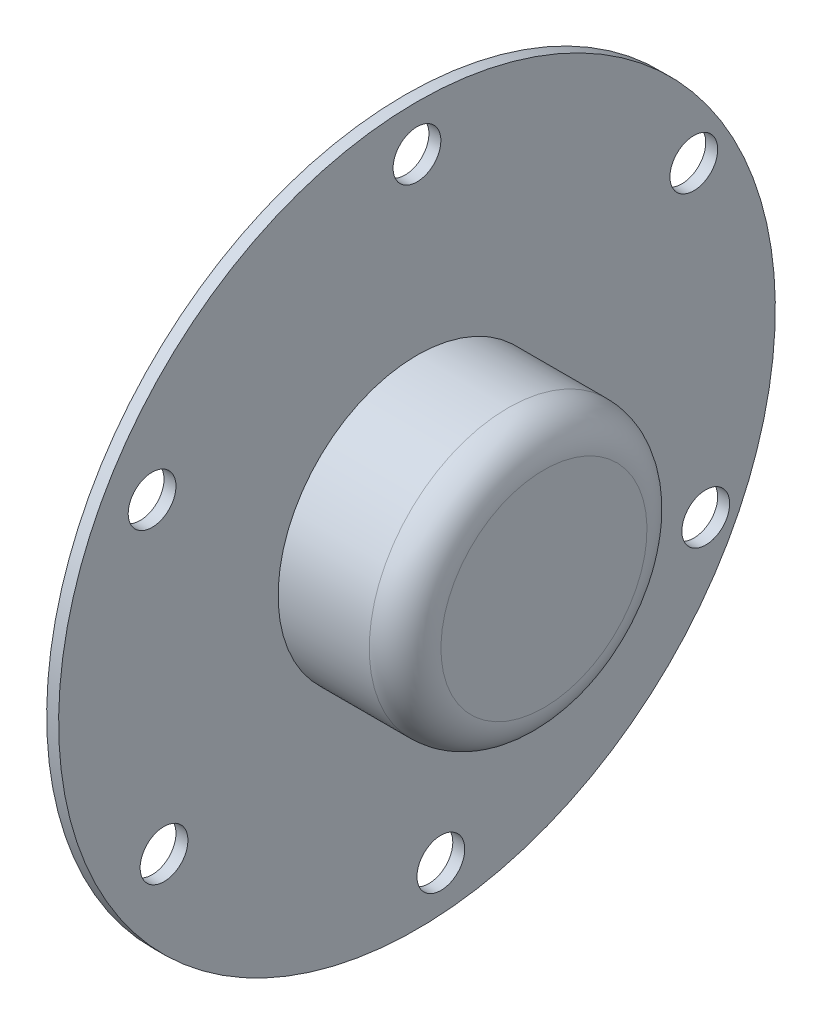
ISO-10303-21;
HEADER;
FILE_DESCRIPTION(('STEP AP214'),'2;1');
FILE_NAME('part.step','',(''),(''),'','','');
FILE_SCHEMA(('AUTOMOTIVE_DESIGN { 1 0 10303 214 1 1 1 1 }'));
ENDSEC;
DATA;
#1=APPLICATION_CONTEXT('core data for automotive mechanical design processes');
#2=APPLICATION_PROTOCOL_DEFINITION('international standard','automotive_design',2000,#1);
#3=PRODUCT_CONTEXT('',#1,'mechanical');
#4=PRODUCT('Part','Part','',(#3));
#5=PRODUCT_RELATED_PRODUCT_CATEGORY('part','',(#4));
#6=PRODUCT_DEFINITION_FORMATION('','',#4);
#7=PRODUCT_DEFINITION_CONTEXT('part definition',#1,'design');
#8=PRODUCT_DEFINITION('design','',#6,#7);
#9=PRODUCT_DEFINITION_SHAPE('','',#8);
#10=(LENGTH_UNIT() NAMED_UNIT(*) SI_UNIT(.MILLI.,.METRE.));
#11=(NAMED_UNIT(*) PLANE_ANGLE_UNIT() SI_UNIT($,.RADIAN.));
#12=(NAMED_UNIT(*) SI_UNIT($,.STERADIAN.) SOLID_ANGLE_UNIT());
#13=UNCERTAINTY_MEASURE_WITH_UNIT(LENGTH_MEASURE(1.E-05),#10,'distance_accuracy_value','');
#14=(GEOMETRIC_REPRESENTATION_CONTEXT(3) GLOBAL_UNCERTAINTY_ASSIGNED_CONTEXT((#13)) GLOBAL_UNIT_ASSIGNED_CONTEXT((#10,
#11,#12)) REPRESENTATION_CONTEXT('',''));
#15=CARTESIAN_POINT('',(0.,0.,0.));
#16=DIRECTION('',(0.,0.,1.));
#17=DIRECTION('',(1.,0.,0.));
#18=AXIS2_PLACEMENT_3D('',#15,#16,#17);
#19=CARTESIAN_POINT('',(1.00000000000016,0.,0.));
#20=DIRECTION('',(-1.,0.,0.));
#21=DIRECTION('',(0.,-1.,0.));
#22=AXIS2_PLACEMENT_3D('',#19,#20,#21);
#23=PLANE('',#22);
#24=CARTESIAN_POINT('',(0.999999999999973,36.80872946,0.));
#25=DIRECTION('',(1.,0.,0.));
#26=DIRECTION('',(0.,1.,0.));
#27=AXIS2_PLACEMENT_3D('',#24,#25,#26);
#28=CIRCLE('',#27,2.);
#29=CARTESIAN_POINT('',(0.999999999999962,38.80872946,0.));
#30=VERTEX_POINT('',#29);
#31=EDGE_CURVE('E58',#30,#30,#28,.T.);
#32=ORIENTED_EDGE('',*,*,#31,.F.);
#33=EDGE_LOOP('',(#32));
#34=FACE_BOUND('',#33,.T.);
#35=CARTESIAN_POINT('',(1.00000000000004,22.8508393262151,22.1757748781788));
#36=DIRECTION('',(1.,0.,0.));
#37=DIRECTION('',(0.,1.,0.));
#38=AXIS2_PLACEMENT_3D('',#35,#36,#37);
#39=CIRCLE('',#38,2.);
#40=CARTESIAN_POINT('',(1.00000000000003,24.8508393262151,22.1757748781788));
#41=VERTEX_POINT('',#40);
#42=EDGE_CURVE('E127',#41,#41,#39,.T.);
#43=ORIENTED_EDGE('',*,*,#42,.F.);
#44=EDGE_LOOP('',(#43));
#45=FACE_BOUND('',#44,.T.);
#46=CARTESIAN_POINT('',(1.00000000000018,-3.33289013378488,21.1757748781784));
#47=DIRECTION('',(1.,0.,0.));
#48=DIRECTION('',(0.,1.,0.));
#49=AXIS2_PLACEMENT_3D('',#46,#47,#48);
#50=CIRCLE('',#49,2.);
#51=CARTESIAN_POINT('',(1.00000000000017,-1.33289013378488,21.1757748781784));
#52=VERTEX_POINT('',#51);
#53=EDGE_CURVE('E83',#52,#52,#50,.T.);
#54=ORIENTED_EDGE('',*,*,#53,.F.);
#55=EDGE_LOOP('',(#54));
#56=FACE_BOUND('',#55,.T.);
#57=CARTESIAN_POINT('',(1.00000000000024,-15.5587294600001,-2.00000000000089));
#58=DIRECTION('',(1.,0.,0.));
#59=DIRECTION('',(0.,1.,0.));
#60=AXIS2_PLACEMENT_3D('',#57,#58,#59);
#61=CIRCLE('',#60,2.);
#62=CARTESIAN_POINT('',(1.00000000000023,-13.5587294600001,-2.00000000000089));
#63=VERTEX_POINT('',#62);
#64=EDGE_CURVE('E134',#63,#63,#61,.T.);
#65=ORIENTED_EDGE('',*,*,#64,.F.);
#66=EDGE_LOOP('',(#65));
#67=FACE_BOUND('',#66,.T.);
#68=CARTESIAN_POINT('',(1.00000000000017,-1.60083932621522,-24.1757748781797));
#69=DIRECTION('',(1.,0.,0.));
#70=DIRECTION('',(0.,1.,0.));
#71=AXIS2_PLACEMENT_3D('',#68,#69,#70);
#72=CIRCLE('',#71,2.);
#73=CARTESIAN_POINT('',(1.00000000000016,0.399160673784787,-24.1757748781797));
#74=VERTEX_POINT('',#73);
#75=EDGE_CURVE('E138',#74,#74,#72,.T.);
#76=ORIENTED_EDGE('',*,*,#75,.F.);
#77=EDGE_LOOP('',(#76));
#78=FACE_BOUND('',#77,.T.);
#79=CARTESIAN_POINT('',(1.00000000000004,24.5828901337848,-23.1757748781792));
#80=DIRECTION('',(1.,0.,0.));
#81=DIRECTION('',(0.,1.,0.));
#82=AXIS2_PLACEMENT_3D('',#79,#80,#81);
#83=CIRCLE('',#82,2.);
#84=CARTESIAN_POINT('',(1.00000000000003,26.5828901337848,-23.1757748781792));
#85=VERTEX_POINT('',#84);
#86=EDGE_CURVE('E142',#85,#85,#83,.T.);
#87=ORIENTED_EDGE('',*,*,#86,.F.);
#88=EDGE_LOOP('',(#87));
#89=FACE_BOUND('',#88,.T.);
#90=CARTESIAN_POINT('',(1.00000000000006,10.625,0.));
#91=DIRECTION('',(1.,0.,0.));
#92=DIRECTION('',(0.,1.,0.));
#93=AXIS2_PLACEMENT_3D('',#90,#91,#92);
#94=CIRCLE('',#93,11.6250000000001);
#95=CARTESIAN_POINT('',(1.,22.25,0.));
#96=VERTEX_POINT('',#95);
#97=EDGE_CURVE('E71',#96,#96,#94,.T.);
#98=ORIENTED_EDGE('',*,*,#97,.F.);
#99=EDGE_LOOP('',(#98));
#100=FACE_BOUND('',#99,.T.);
#101=CARTESIAN_POINT('',(1.00000000000016,10.625,0.));
#102=DIRECTION('',(1.,0.,0.));
#103=DIRECTION('',(0.,1.,0.));
#104=AXIS2_PLACEMENT_3D('',#101,#102,#103);
#105=CIRCLE('',#104,30.);
#106=CARTESIAN_POINT('',(1.,40.625,0.));
#107=VERTEX_POINT('',#106);
#108=EDGE_CURVE('E50',#107,#107,#105,.T.);
#109=ORIENTED_EDGE('',*,*,#108,.T.);
#110=EDGE_LOOP('',(#109));
#111=FACE_BOUND('',#110,.T.);
#112=ADVANCED_FACE('F37',(#34,#45,#56,#67,#78,#89,#100,#111),#23,.F.);
#113=CARTESIAN_POINT('',(11.63,10.625,0.));
#114=DIRECTION('',(1.,0.,0.));
#115=DIRECTION('',(0.,1.,0.));
#116=AXIS2_PLACEMENT_3D('',#113,#114,#115);
#117=CYLINDRICAL_SURFACE('',#116,30.0000000000001);
#118=ORIENTED_EDGE('',*,*,#108,.F.);
#119=EDGE_LOOP('',(#118));
#120=FACE_BOUND('',#119,.T.);
#121=CARTESIAN_POINT('',(1.56125112837913E-13,10.6249999999999,0.));
#122=DIRECTION('',(1.,0.,0.));
#123=DIRECTION('',(0.,1.,0.));
#124=AXIS2_PLACEMENT_3D('',#121,#122,#123);
#125=CIRCLE('',#124,30.0000000000001);
#126=CARTESIAN_POINT('',(0.,40.625,0.));
#127=VERTEX_POINT('',#126);
#128=EDGE_CURVE('E88',#127,#127,#125,.T.);
#129=ORIENTED_EDGE('',*,*,#128,.T.);
#130=EDGE_LOOP('',(#129));
#131=FACE_BOUND('',#130,.T.);
#132=ADVANCED_FACE('F94',(#120,#131),#117,.T.);
#133=CARTESIAN_POINT('',(1.60203007576216E-13,0.,0.));
#134=DIRECTION('',(1.,0.,0.));
#135=DIRECTION('',(0.,1.,0.));
#136=AXIS2_PLACEMENT_3D('',#133,#134,#135);
#137=PLANE('',#136);
#138=CARTESIAN_POINT('',(0.,36.80872946,0.));
#139=DIRECTION('',(1.,0.,0.));
#140=DIRECTION('',(0.,1.,0.));
#141=AXIS2_PLACEMENT_3D('',#138,#139,#140);
#142=CIRCLE('',#141,2.);
#143=CARTESIAN_POINT('',(0.,38.80872946,0.));
#144=VERTEX_POINT('',#143);
#145=EDGE_CURVE('E41',#144,#144,#142,.T.);
#146=ORIENTED_EDGE('',*,*,#145,.T.);
#147=EDGE_LOOP('',(#146));
#148=FACE_BOUND('',#147,.T.);
#149=CARTESIAN_POINT('',(0.,22.8508393262151,22.1757748781788));
#150=DIRECTION('',(1.,0.,0.));
#151=DIRECTION('',(0.,1.,0.));
#152=AXIS2_PLACEMENT_3D('',#149,#150,#151);
#153=CIRCLE('',#152,2.);
#154=CARTESIAN_POINT('',(0.,24.8508393262151,22.1757748781788));
#155=VERTEX_POINT('',#154);
#156=EDGE_CURVE('E66',#155,#155,#153,.T.);
#157=ORIENTED_EDGE('',*,*,#156,.T.);
#158=EDGE_LOOP('',(#157));
#159=FACE_BOUND('',#158,.T.);
#160=CARTESIAN_POINT('',(1.77592315853126E-13,-3.33289013378488,21.1757748781784));
#161=DIRECTION('',(1.,0.,0.));
#162=DIRECTION('',(0.,1.,0.));
#163=AXIS2_PLACEMENT_3D('',#160,#161,#162);
#164=CIRCLE('',#163,2.);
#165=CARTESIAN_POINT('',(1.67235757787592E-13,-1.33289013378488,21.1757748781784));
#166=VERTEX_POINT('',#165);
#167=EDGE_CURVE('E64',#166,#166,#164,.T.);
#168=ORIENTED_EDGE('',*,*,#167,.T.);
#169=EDGE_LOOP('',(#168));
#170=FACE_BOUND('',#169,.T.);
#171=CARTESIAN_POINT('',(2.40909722726279E-13,-15.5587294600001,-2.00000000000089));
#172=DIRECTION('',(1.,0.,0.));
#173=DIRECTION('',(0.,1.,0.));
#174=AXIS2_PLACEMENT_3D('',#171,#172,#173);
#175=CIRCLE('',#174,2.);
#176=CARTESIAN_POINT('',(2.30553164660746E-13,-13.5587294600001,-2.00000000000089));
#177=VERTEX_POINT('',#176);
#178=EDGE_CURVE('E61',#177,#177,#175,.T.);
#179=ORIENTED_EDGE('',*,*,#178,.T.);
#180=EDGE_LOOP('',(#179));
#181=FACE_BOUND('',#180,.T.);
#182=CARTESIAN_POINT('',(1.68485017604247E-13,-1.60083932621522,-24.1757748781797));
#183=DIRECTION('',(1.,0.,0.));
#184=DIRECTION('',(0.,1.,0.));
#185=AXIS2_PLACEMENT_3D('',#182,#183,#184);
#186=CIRCLE('',#185,2.);
#187=CARTESIAN_POINT('',(1.58128459538714E-13,0.399160673784782,-24.1757748781797));
#188=VERTEX_POINT('',#187);
#189=EDGE_CURVE('E57',#188,#188,#186,.T.);
#190=ORIENTED_EDGE('',*,*,#189,.T.);
#191=EDGE_LOOP('',(#190));
#192=FACE_BOUND('',#191,.T.);
#193=CARTESIAN_POINT('',(0.,24.5828901337848,-23.1757748781792));
#194=DIRECTION('',(1.,0.,0.));
#195=DIRECTION('',(0.,1.,0.));
#196=AXIS2_PLACEMENT_3D('',#193,#194,#195);
#197=CIRCLE('',#196,2.);
#198=CARTESIAN_POINT('',(0.,26.5828901337848,-23.1757748781792));
#199=VERTEX_POINT('',#198);
#200=EDGE_CURVE('E54',#199,#199,#197,.T.);
#201=ORIENTED_EDGE('',*,*,#200,.T.);
#202=EDGE_LOOP('',(#201));
#203=FACE_BOUND('',#202,.T.);
#204=ORIENTED_EDGE('',*,*,#128,.F.);
#205=EDGE_LOOP('',(#204));
#206=FACE_BOUND('',#205,.T.);
#207=CARTESIAN_POINT('',(0.,10.6249999999999,0.));
#208=DIRECTION('',(1.,0.,0.));
#209=DIRECTION('',(0.,1.,0.));
#210=AXIS2_PLACEMENT_3D('',#207,#208,#209);
#211=CIRCLE('',#210,10.6250000000001);
#212=CARTESIAN_POINT('',(0.,21.25,0.));
#213=VERTEX_POINT('',#212);
#214=EDGE_CURVE('E80',#213,#213,#211,.T.);
#215=ORIENTED_EDGE('',*,*,#214,.T.);
#216=EDGE_LOOP('',(#215));
#217=FACE_BOUND('',#216,.T.);
#218=ADVANCED_FACE('F97',(#148,#159,#170,#181,#192,#203,#206,#217),#137,.F.);
#219=CARTESIAN_POINT('',(11.63,10.625,0.));
#220=DIRECTION('',(1.,0.,0.));
#221=DIRECTION('',(0.,1.,0.));
#222=AXIS2_PLACEMENT_3D('',#219,#220,#221);
#223=CYLINDRICAL_SURFACE('',#222,10.625);
#224=CARTESIAN_POINT('',(10.6250000000001,10.625,0.));
#225=DIRECTION('',(1.,0.,0.));
#226=DIRECTION('',(0.,1.,0.));
#227=AXIS2_PLACEMENT_3D('',#224,#225,#226);
#228=CIRCLE('',#227,10.625);
#229=CARTESIAN_POINT('',(10.625,21.25,0.));
#230=VERTEX_POINT('',#229);
#231=EDGE_CURVE('E75',#230,#230,#228,.T.);
#232=ORIENTED_EDGE('',*,*,#231,.T.);
#233=EDGE_LOOP('',(#232));
#234=FACE_BOUND('',#233,.T.);
#235=ORIENTED_EDGE('',*,*,#214,.F.);
#236=EDGE_LOOP('',(#235));
#237=FACE_BOUND('',#236,.T.);
#238=ADVANCED_FACE('F103',(#234,#237),#223,.F.);
#239=CARTESIAN_POINT('',(10.6250000000001,0.,0.));
#240=DIRECTION('',(-1.,0.,0.));
#241=DIRECTION('',(0.,-1.,0.));
#242=AXIS2_PLACEMENT_3D('',#239,#240,#241);
#243=PLANE('',#242);
#244=ORIENTED_EDGE('',*,*,#231,.F.);
#245=EDGE_LOOP('',(#244));
#246=FACE_BOUND('',#245,.T.);
#247=ADVANCED_FACE('F108',(#246),#243,.T.);
#248=CARTESIAN_POINT('',(11.6300000000001,0.,0.));
#249=DIRECTION('',(-1.,0.,0.));
#250=DIRECTION('',(0.,-1.,0.));
#251=AXIS2_PLACEMENT_3D('',#248,#249,#250);
#252=PLANE('',#251);
#253=CARTESIAN_POINT('',(11.63,10.625,0.));
#254=DIRECTION('',(-1.,0.,0.));
#255=DIRECTION('',(0.,-1.,0.));
#256=AXIS2_PLACEMENT_3D('',#253,#254,#255);
#257=CIRCLE('',#256,8.62500000000002);
#258=CARTESIAN_POINT('',(11.6300000000001,1.99999999999998,0.));
#259=VERTEX_POINT('',#258);
#260=EDGE_CURVE('E45',#259,#259,#257,.F.);
#261=ORIENTED_EDGE('',*,*,#260,.T.);
#262=EDGE_LOOP('',(#261));
#263=FACE_BOUND('',#262,.T.);
#264=ADVANCED_FACE('F114',(#263),#252,.F.);
#265=CARTESIAN_POINT('',(11.63,10.625,0.));
#266=DIRECTION('',(1.,0.,0.));
#267=DIRECTION('',(0.,1.,0.));
#268=AXIS2_PLACEMENT_3D('',#265,#266,#267);
#269=CYLINDRICAL_SURFACE('',#268,11.625);
#270=CARTESIAN_POINT('',(8.63000000000003,10.625,0.));
#271=DIRECTION('',(-1.,0.,0.));
#272=DIRECTION('',(0.,-1.,0.));
#273=AXIS2_PLACEMENT_3D('',#270,#271,#272);
#274=CIRCLE('',#273,11.625);
#275=CARTESIAN_POINT('',(8.63000000000009,-1.00000000000003,0.));
#276=VERTEX_POINT('',#275);
#277=EDGE_CURVE('E10',#276,#276,#274,.T.);
#278=ORIENTED_EDGE('',*,*,#277,.T.);
#279=EDGE_LOOP('',(#278));
#280=FACE_BOUND('',#279,.T.);
#281=ORIENTED_EDGE('',*,*,#97,.T.);
#282=EDGE_LOOP('',(#281));
#283=FACE_BOUND('',#282,.T.);
#284=ADVANCED_FACE('F175',(#280,#283),#269,.T.);
#285=CARTESIAN_POINT('',(8.63000000000003,10.625,0.));
#286=DIRECTION('',(-1.,0.,0.));
#287=DIRECTION('',(0.,-1.,0.));
#288=AXIS2_PLACEMENT_3D('',#285,#286,#287);
#289=TOROIDAL_SURFACE('',#288,8.62500000000002,3.);
#290=ORIENTED_EDGE('',*,*,#277,.F.);
#291=EDGE_LOOP('',(#290));
#292=FACE_BOUND('',#291,.T.);
#293=ORIENTED_EDGE('',*,*,#260,.F.);
#294=EDGE_LOOP('',(#293));
#295=FACE_BOUND('',#294,.T.);
#296=ADVANCED_FACE('F39',(#292,#295),#289,.T.);
#297=CARTESIAN_POINT('',(-0.999999999999964,24.5828901337848,-23.1757748781792));
#298=DIRECTION('',(1.,0.,0.));
#299=DIRECTION('',(0.,1.,0.));
#300=AXIS2_PLACEMENT_3D('',#297,#298,#299);
#301=CYLINDRICAL_SURFACE('',#300,2.);
#302=ORIENTED_EDGE('',*,*,#86,.T.);
#303=EDGE_LOOP('',(#302));
#304=FACE_BOUND('',#303,.T.);
#305=ORIENTED_EDGE('',*,*,#200,.F.);
#306=EDGE_LOOP('',(#305));
#307=FACE_BOUND('',#306,.T.);
#308=ADVANCED_FACE('F166',(#304,#307),#301,.F.);
#309=CARTESIAN_POINT('',(-0.999999999999828,-1.60083932621523,-24.1757748781797));
#310=DIRECTION('',(1.,0.,0.));
#311=DIRECTION('',(0.,1.,0.));
#312=AXIS2_PLACEMENT_3D('',#309,#310,#311);
#313=CYLINDRICAL_SURFACE('',#312,2.);
#314=ORIENTED_EDGE('',*,*,#75,.T.);
#315=EDGE_LOOP('',(#314));
#316=FACE_BOUND('',#315,.T.);
#317=ORIENTED_EDGE('',*,*,#189,.F.);
#318=EDGE_LOOP('',(#317));
#319=FACE_BOUND('',#318,.T.);
#320=ADVANCED_FACE('F169',(#316,#319),#313,.F.);
#321=CARTESIAN_POINT('',(-0.999999999999756,-15.5587294600001,-2.00000000000089));
#322=DIRECTION('',(1.,0.,0.));
#323=DIRECTION('',(0.,1.,0.));
#324=AXIS2_PLACEMENT_3D('',#321,#322,#323);
#325=CYLINDRICAL_SURFACE('',#324,2.);
#326=ORIENTED_EDGE('',*,*,#64,.T.);
#327=EDGE_LOOP('',(#326));
#328=FACE_BOUND('',#327,.T.);
#329=ORIENTED_EDGE('',*,*,#178,.F.);
#330=EDGE_LOOP('',(#329));
#331=FACE_BOUND('',#330,.T.);
#332=ADVANCED_FACE('F163',(#328,#331),#325,.F.);
#333=CARTESIAN_POINT('',(-0.999999999999819,-3.33289013378489,21.1757748781784));
#334=DIRECTION('',(1.,0.,0.));
#335=DIRECTION('',(0.,1.,0.));
#336=AXIS2_PLACEMENT_3D('',#333,#334,#335);
#337=CYLINDRICAL_SURFACE('',#336,2.);
#338=ORIENTED_EDGE('',*,*,#53,.T.);
#339=EDGE_LOOP('',(#338));
#340=FACE_BOUND('',#339,.T.);
#341=ORIENTED_EDGE('',*,*,#167,.F.);
#342=EDGE_LOOP('',(#341));
#343=FACE_BOUND('',#342,.T.);
#344=ADVANCED_FACE('F155',(#340,#343),#337,.F.);
#345=CARTESIAN_POINT('',(-0.999999999999955,22.8508393262151,22.1757748781788));
#346=DIRECTION('',(1.,0.,0.));
#347=DIRECTION('',(0.,1.,0.));
#348=AXIS2_PLACEMENT_3D('',#345,#346,#347);
#349=CYLINDRICAL_SURFACE('',#348,2.);
#350=ORIENTED_EDGE('',*,*,#42,.T.);
#351=EDGE_LOOP('',(#350));
#352=FACE_BOUND('',#351,.T.);
#353=ORIENTED_EDGE('',*,*,#156,.F.);
#354=EDGE_LOOP('',(#353));
#355=FACE_BOUND('',#354,.T.);
#356=ADVANCED_FACE('F151',(#352,#355),#349,.F.);
#357=CARTESIAN_POINT('',(-1.00000000000003,36.80872946,0.));
#358=DIRECTION('',(1.,0.,0.));
#359=DIRECTION('',(0.,1.,0.));
#360=AXIS2_PLACEMENT_3D('',#357,#358,#359);
#361=CYLINDRICAL_SURFACE('',#360,2.);
#362=ORIENTED_EDGE('',*,*,#31,.T.);
#363=EDGE_LOOP('',(#362));
#364=FACE_BOUND('',#363,.T.);
#365=ORIENTED_EDGE('',*,*,#145,.F.);
#366=EDGE_LOOP('',(#365));
#367=FACE_BOUND('',#366,.T.);
#368=ADVANCED_FACE('F154',(#364,#367),#361,.F.);
#369=CLOSED_SHELL('',(#112,#132,#218,#238,#247,#264,#284,#296,#308,#320,#332,#344,#356,#368));
#370=MANIFOLD_SOLID_BREP('B2',#369);
#371=ADVANCED_BREP_SHAPE_REPRESENTATION('',(#18,#370),#14);
#372=SHAPE_DEFINITION_REPRESENTATION(#9,#371);
ENDSEC;
END-ISO-10303-21;
